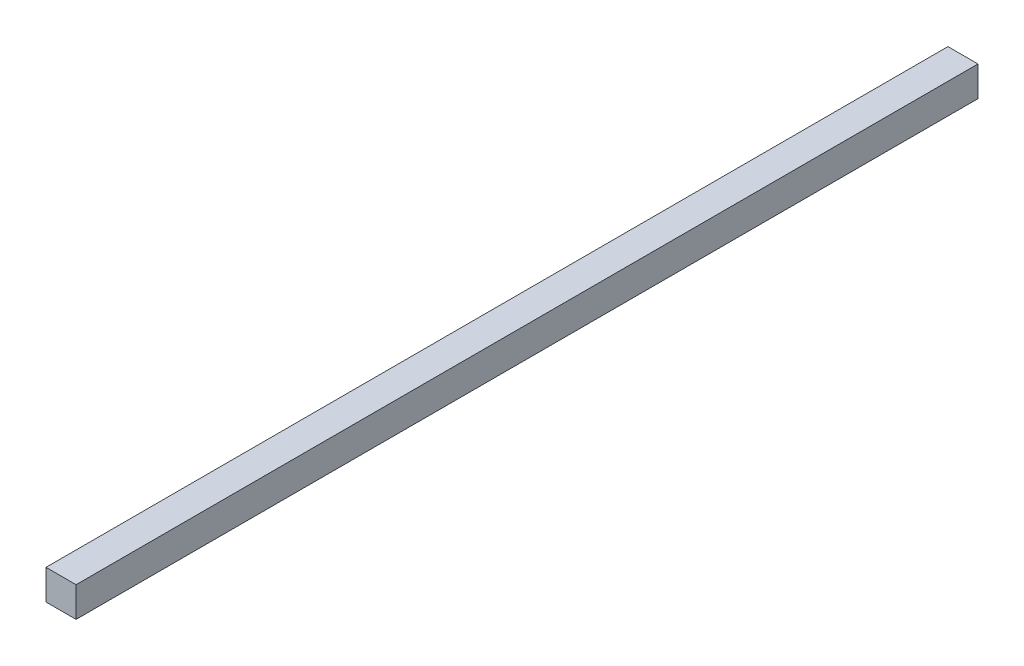
ISO-10303-21;
HEADER;
FILE_DESCRIPTION(('STEP AP214'),'2;1');
FILE_NAME('part.step','',(''),(''),'','','');
FILE_SCHEMA(('AUTOMOTIVE_DESIGN { 1 0 10303 214 1 1 1 1 }'));
ENDSEC;
DATA;
#1=APPLICATION_CONTEXT('core data for automotive mechanical design processes');
#2=APPLICATION_PROTOCOL_DEFINITION('international standard','automotive_design',2000,#1);
#3=PRODUCT_CONTEXT('',#1,'mechanical');
#4=PRODUCT('Part','Part','',(#3));
#5=PRODUCT_RELATED_PRODUCT_CATEGORY('part','',(#4));
#6=PRODUCT_DEFINITION_FORMATION('','',#4);
#7=PRODUCT_DEFINITION_CONTEXT('part definition',#1,'design');
#8=PRODUCT_DEFINITION('design','',#6,#7);
#9=PRODUCT_DEFINITION_SHAPE('','',#8);
#10=(LENGTH_UNIT() NAMED_UNIT(*) SI_UNIT(.MILLI.,.METRE.));
#11=(NAMED_UNIT(*) PLANE_ANGLE_UNIT() SI_UNIT($,.RADIAN.));
#12=(NAMED_UNIT(*) SI_UNIT($,.STERADIAN.) SOLID_ANGLE_UNIT());
#13=UNCERTAINTY_MEASURE_WITH_UNIT(LENGTH_MEASURE(1.E-05),#10,'distance_accuracy_value','');
#14=(GEOMETRIC_REPRESENTATION_CONTEXT(3) GLOBAL_UNCERTAINTY_ASSIGNED_CONTEXT((#13)) GLOBAL_UNIT_ASSIGNED_CONTEXT((#10,
#11,#12)) REPRESENTATION_CONTEXT('',''));
#15=CARTESIAN_POINT('',(0.,0.,0.));
#16=DIRECTION('',(0.,0.,1.));
#17=DIRECTION('',(1.,0.,0.));
#18=AXIS2_PLACEMENT_3D('',#15,#16,#17);
#19=CARTESIAN_POINT('',(2.5,-2.5,150.));
#20=DIRECTION('',(-1.,0.,0.));
#21=DIRECTION('',(0.,0.,1.));
#22=AXIS2_PLACEMENT_3D('',#19,#20,#21);
#23=PLANE('',#22);
#24=DIRECTION('',(0.,1.,0.));
#25=VECTOR('',#24,1.);
#26=CARTESIAN_POINT('',(2.5,-2.5,0.));
#27=LINE('',#26,#25);
#28=CARTESIAN_POINT('',(2.5,-2.5,0.));
#29=VERTEX_POINT('',#28);
#30=CARTESIAN_POINT('',(2.5,2.5,0.));
#31=VERTEX_POINT('',#30);
#32=EDGE_CURVE('E102',#29,#31,#27,.T.);
#33=ORIENTED_EDGE('',*,*,#32,.T.);
#34=DIRECTION('',(0.,0.,-1.));
#35=VECTOR('',#34,1.);
#36=CARTESIAN_POINT('',(2.5,2.5,150.));
#37=LINE('',#36,#35);
#38=CARTESIAN_POINT('',(2.5,2.5,150.));
#39=VERTEX_POINT('',#38);
#40=EDGE_CURVE('E11',#39,#31,#37,.T.);
#41=ORIENTED_EDGE('',*,*,#40,.F.);
#42=DIRECTION('',(0.,1.,0.));
#43=VECTOR('',#42,1.);
#44=CARTESIAN_POINT('',(2.5,-2.5,150.));
#45=LINE('',#44,#43);
#46=CARTESIAN_POINT('',(2.5,-2.5,150.));
#47=VERTEX_POINT('',#46);
#48=EDGE_CURVE('E90',#47,#39,#45,.T.);
#49=ORIENTED_EDGE('',*,*,#48,.F.);
#50=DIRECTION('',(0.,0.,-1.));
#51=VECTOR('',#50,1.);
#52=CARTESIAN_POINT('',(2.5,-2.5,150.));
#53=LINE('',#52,#51);
#54=EDGE_CURVE('E98',#47,#29,#53,.T.);
#55=ORIENTED_EDGE('',*,*,#54,.T.);
#56=EDGE_LOOP('',(#33,#41,#49,#55));
#57=FACE_BOUND('',#56,.T.);
#58=ADVANCED_FACE('F39',(#57),#23,.F.);
#59=CARTESIAN_POINT('',(-2.5,2.5,150.));
#60=DIRECTION('',(0.,-1.,0.));
#61=DIRECTION('',(0.,0.,-1.));
#62=AXIS2_PLACEMENT_3D('',#59,#60,#61);
#63=PLANE('',#62);
#64=DIRECTION('',(-1.,0.,0.));
#65=VECTOR('',#64,1.);
#66=CARTESIAN_POINT('',(-2.5,2.5,0.));
#67=LINE('',#66,#65);
#68=CARTESIAN_POINT('',(-2.5,2.5,0.));
#69=VERTEX_POINT('',#68);
#70=EDGE_CURVE('E94',#31,#69,#67,.T.);
#71=ORIENTED_EDGE('',*,*,#70,.T.);
#72=DIRECTION('',(0.,0.,-1.));
#73=VECTOR('',#72,1.);
#74=CARTESIAN_POINT('',(-2.5,2.5,150.));
#75=LINE('',#74,#73);
#76=CARTESIAN_POINT('',(-2.5,2.5,150.));
#77=VERTEX_POINT('',#76);
#78=EDGE_CURVE('E47',#77,#69,#75,.T.);
#79=ORIENTED_EDGE('',*,*,#78,.F.);
#80=DIRECTION('',(-1.,0.,0.));
#81=VECTOR('',#80,1.);
#82=CARTESIAN_POINT('',(-2.5,2.5,150.));
#83=LINE('',#82,#81);
#84=EDGE_CURVE('E85',#39,#77,#83,.T.);
#85=ORIENTED_EDGE('',*,*,#84,.F.);
#86=ORIENTED_EDGE('',*,*,#40,.T.);
#87=EDGE_LOOP('',(#71,#79,#85,#86));
#88=FACE_BOUND('',#87,.T.);
#89=ADVANCED_FACE('F93',(#88),#63,.F.);
#90=CARTESIAN_POINT('',(-2.5,-2.5,150.));
#91=DIRECTION('',(1.,0.,0.));
#92=DIRECTION('',(0.,0.,-1.));
#93=AXIS2_PLACEMENT_3D('',#90,#91,#92);
#94=PLANE('',#93);
#95=DIRECTION('',(0.,-1.,0.));
#96=VECTOR('',#95,1.);
#97=CARTESIAN_POINT('',(-2.5,-2.5,0.));
#98=LINE('',#97,#96);
#99=CARTESIAN_POINT('',(-2.5,-2.5,0.));
#100=VERTEX_POINT('',#99);
#101=EDGE_CURVE('E72',#69,#100,#98,.T.);
#102=ORIENTED_EDGE('',*,*,#101,.T.);
#103=DIRECTION('',(0.,0.,-1.));
#104=VECTOR('',#103,1.);
#105=CARTESIAN_POINT('',(-2.5,-2.5,150.));
#106=LINE('',#105,#104);
#107=CARTESIAN_POINT('',(-2.5,-2.5,150.));
#108=VERTEX_POINT('',#107);
#109=EDGE_CURVE('E95',#108,#100,#106,.T.);
#110=ORIENTED_EDGE('',*,*,#109,.F.);
#111=DIRECTION('',(0.,-1.,0.));
#112=VECTOR('',#111,1.);
#113=CARTESIAN_POINT('',(-2.5,-2.5,150.));
#114=LINE('',#113,#112);
#115=EDGE_CURVE('E88',#77,#108,#114,.T.);
#116=ORIENTED_EDGE('',*,*,#115,.F.);
#117=ORIENTED_EDGE('',*,*,#78,.T.);
#118=EDGE_LOOP('',(#102,#110,#116,#117));
#119=FACE_BOUND('',#118,.T.);
#120=ADVANCED_FACE('F96',(#119),#94,.F.);
#121=CARTESIAN_POINT('',(-2.5,-2.5,150.));
#122=DIRECTION('',(0.,1.,0.));
#123=DIRECTION('',(0.,0.,1.));
#124=AXIS2_PLACEMENT_3D('',#121,#122,#123);
#125=PLANE('',#124);
#126=DIRECTION('',(1.,0.,0.));
#127=VECTOR('',#126,1.);
#128=CARTESIAN_POINT('',(-2.5,-2.5,0.));
#129=LINE('',#128,#127);
#130=EDGE_CURVE('E78',#100,#29,#129,.T.);
#131=ORIENTED_EDGE('',*,*,#130,.T.);
#132=ORIENTED_EDGE('',*,*,#54,.F.);
#133=DIRECTION('',(1.,0.,0.));
#134=VECTOR('',#133,1.);
#135=CARTESIAN_POINT('',(-2.5,-2.5,150.));
#136=LINE('',#135,#134);
#137=EDGE_CURVE('E55',#108,#47,#136,.T.);
#138=ORIENTED_EDGE('',*,*,#137,.F.);
#139=ORIENTED_EDGE('',*,*,#109,.T.);
#140=EDGE_LOOP('',(#131,#132,#138,#139));
#141=FACE_BOUND('',#140,.T.);
#142=ADVANCED_FACE('F109',(#141),#125,.F.);
#143=CARTESIAN_POINT('',(0.,0.,150.));
#144=DIRECTION('',(0.,0.,-1.));
#145=DIRECTION('',(-1.,0.,0.));
#146=AXIS2_PLACEMENT_3D('',#143,#144,#145);
#147=PLANE('',#146);
#148=ORIENTED_EDGE('',*,*,#48,.T.);
#149=ORIENTED_EDGE('',*,*,#84,.T.);
#150=ORIENTED_EDGE('',*,*,#115,.T.);
#151=ORIENTED_EDGE('',*,*,#137,.T.);
#152=EDGE_LOOP('',(#148,#149,#150,#151));
#153=FACE_BOUND('',#152,.T.);
#154=ADVANCED_FACE('F86',(#153),#147,.F.);
#155=CARTESIAN_POINT('',(0.,0.,0.));
#156=DIRECTION('',(0.,0.,-1.));
#157=DIRECTION('',(-1.,0.,0.));
#158=AXIS2_PLACEMENT_3D('',#155,#156,#157);
#159=PLANE('',#158);
#160=ORIENTED_EDGE('',*,*,#32,.F.);
#161=ORIENTED_EDGE('',*,*,#130,.F.);
#162=ORIENTED_EDGE('',*,*,#101,.F.);
#163=ORIENTED_EDGE('',*,*,#70,.F.);
#164=EDGE_LOOP('',(#160,#161,#162,#163));
#165=FACE_BOUND('',#164,.T.);
#166=ADVANCED_FACE('F112',(#165),#159,.T.);
#167=CLOSED_SHELL('',(#58,#89,#120,#142,#154,#166));
#168=MANIFOLD_SOLID_BREP('B2',#167);
#169=ADVANCED_BREP_SHAPE_REPRESENTATION('',(#18,#168),#14);
#170=SHAPE_DEFINITION_REPRESENTATION(#9,#169);
ENDSEC;
END-ISO-10303-21;
